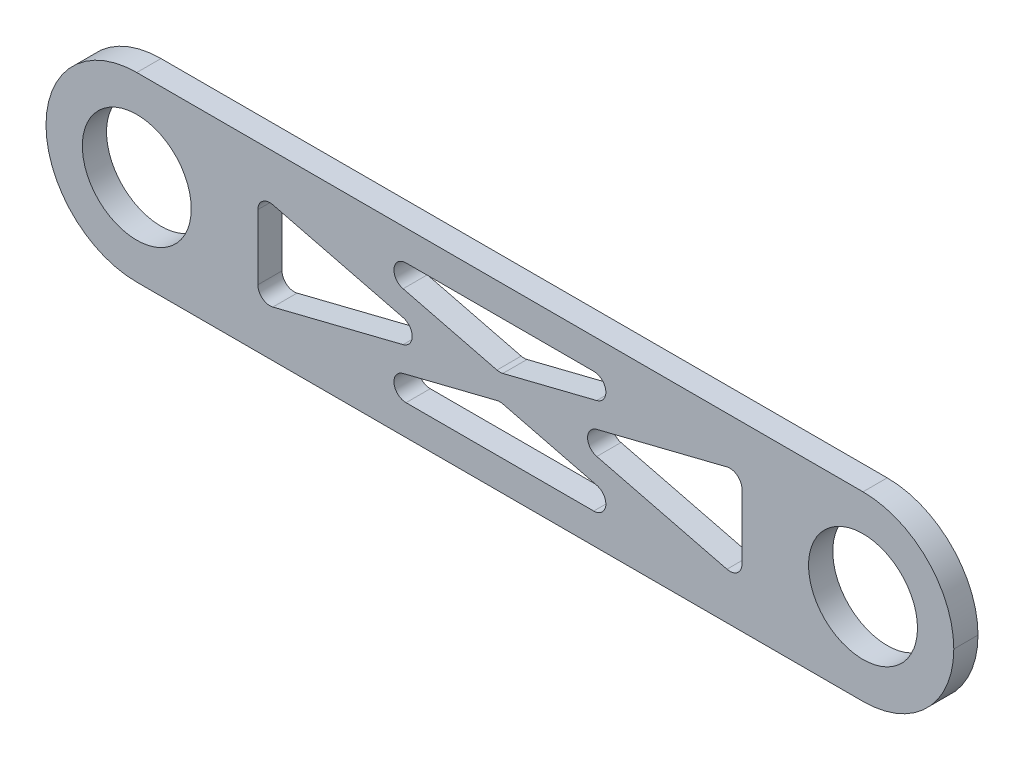
ISO-10303-21;
HEADER;
FILE_DESCRIPTION(('STEP AP214'),'2;1');
FILE_NAME('part.step','',(''),(''),'','','');
FILE_SCHEMA(('AUTOMOTIVE_DESIGN { 1 0 10303 214 1 1 1 1 }'));
ENDSEC;
DATA;
#1=APPLICATION_CONTEXT('core data for automotive mechanical design processes');
#2=APPLICATION_PROTOCOL_DEFINITION('international standard','automotive_design',2000,#1);
#3=PRODUCT_CONTEXT('',#1,'mechanical');
#4=PRODUCT('Part','Part','',(#3));
#5=PRODUCT_RELATED_PRODUCT_CATEGORY('part','',(#4));
#6=PRODUCT_DEFINITION_FORMATION('','',#4);
#7=PRODUCT_DEFINITION_CONTEXT('part definition',#1,'design');
#8=PRODUCT_DEFINITION('design','',#6,#7);
#9=PRODUCT_DEFINITION_SHAPE('','',#8);
#10=(LENGTH_UNIT() NAMED_UNIT(*) SI_UNIT(.MILLI.,.METRE.));
#11=(NAMED_UNIT(*) PLANE_ANGLE_UNIT() SI_UNIT($,.RADIAN.));
#12=(NAMED_UNIT(*) SI_UNIT($,.STERADIAN.) SOLID_ANGLE_UNIT());
#13=UNCERTAINTY_MEASURE_WITH_UNIT(LENGTH_MEASURE(1.E-05),#10,'distance_accuracy_value','');
#14=(GEOMETRIC_REPRESENTATION_CONTEXT(3) GLOBAL_UNCERTAINTY_ASSIGNED_CONTEXT((#13)) GLOBAL_UNIT_ASSIGNED_CONTEXT((#10,
#11,#12)) REPRESENTATION_CONTEXT('',''));
#15=CARTESIAN_POINT('',(0.,0.,0.));
#16=DIRECTION('',(0.,0.,1.));
#17=DIRECTION('',(1.,0.,0.));
#18=AXIS2_PLACEMENT_3D('',#15,#16,#17);
#19=CARTESIAN_POINT('',(0.,0.,2.));
#20=DIRECTION('',(0.,0.,-1.));
#21=DIRECTION('',(-1.,0.,0.));
#22=AXIS2_PLACEMENT_3D('',#19,#20,#21);
#23=PLANE('',#22);
#24=DIRECTION('',(0.970142500145332,0.242535625036333,0.));
#25=VECTOR('',#24,1.);
#26=CARTESIAN_POINT('',(-0.242535625036334,0.970142500145335,2.));
#27=LINE('',#26,#25);
#28=CARTESIAN_POINT('',(-18.7574643749637,-3.6585896873365,2.));
#29=VERTEX_POINT('',#28);
#30=CARTESIAN_POINT('',(-8.003675626199,-0.970142500145333,2.));
#31=VERTEX_POINT('',#30);
#32=EDGE_CURVE('E649',#29,#31,#27,.T.);
#33=ORIENTED_EDGE('',*,*,#32,.F.);
#34=CARTESIAN_POINT('',(-19.,-2.68844718719117,2.));
#35=DIRECTION('',(0.,0.,-1.));
#36=DIRECTION('',(-1.,0.,0.));
#37=AXIS2_PLACEMENT_3D('',#34,#35,#36);
#38=CIRCLE('',#37,1.);
#39=CARTESIAN_POINT('',(-20.,-2.68844718719117,2.));
#40=VERTEX_POINT('',#39);
#41=EDGE_CURVE('E466',#29,#40,#38,.T.);
#42=ORIENTED_EDGE('',*,*,#41,.T.);
#43=DIRECTION('',(0.,1.,0.));
#44=VECTOR('',#43,1.);
#45=CARTESIAN_POINT('',(-20.,0.,2.));
#46=LINE('',#45,#44);
#47=CARTESIAN_POINT('',(-20.,2.68844718719117,2.));
#48=VERTEX_POINT('',#47);
#49=EDGE_CURVE('E653',#40,#48,#46,.T.);
#50=ORIENTED_EDGE('',*,*,#49,.T.);
#51=CARTESIAN_POINT('',(-19.,2.68844718719117,2.));
#52=DIRECTION('',(0.,0.,-1.));
#53=DIRECTION('',(-1.,0.,0.));
#54=AXIS2_PLACEMENT_3D('',#51,#52,#53);
#55=CIRCLE('',#54,1.);
#56=CARTESIAN_POINT('',(-18.7574643749637,3.6585896873365,2.));
#57=VERTEX_POINT('',#56);
#58=EDGE_CURVE('E470',#48,#57,#55,.T.);
#59=ORIENTED_EDGE('',*,*,#58,.T.);
#60=DIRECTION('',(0.970142500145332,-0.242535625036333,0.));
#61=VECTOR('',#60,1.);
#62=CARTESIAN_POINT('',(-0.242535625036335,-0.970142500145337,2.));
#63=LINE('',#62,#61);
#64=CARTESIAN_POINT('',(-8.003675626199,0.970142500145332,2.));
#65=VERTEX_POINT('',#64);
#66=EDGE_CURVE('E650',#57,#65,#63,.T.);
#67=ORIENTED_EDGE('',*,*,#66,.T.);
#68=CARTESIAN_POINT('',(-8.24621125123533,0.,2.));
#69=DIRECTION('',(0.,0.,-1.));
#70=DIRECTION('',(-1.,0.,0.));
#71=AXIS2_PLACEMENT_3D('',#68,#69,#70);
#72=CIRCLE('',#71,1.);
#73=EDGE_CURVE('E462',#65,#31,#72,.T.);
#74=ORIENTED_EDGE('',*,*,#73,.T.);
#75=EDGE_LOOP('',(#33,#42,#50,#59,#67,#74));
#76=FACE_BOUND('',#75,.T.);
#77=DIRECTION('',(0.970142500145332,0.242535625036333,0.));
#78=VECTOR('',#77,1.);
#79=CARTESIAN_POINT('',(-0.242535625036334,0.970142500145335,2.));
#80=LINE('',#79,#78);
#81=CARTESIAN_POINT('',(0.242535625036327,1.0914103126635,2.));
#82=VERTEX_POINT('',#81);
#83=CARTESIAN_POINT('',(7.996324373801,3.02985749985467,2.));
#84=VERTEX_POINT('',#83);
#85=EDGE_CURVE('E529',#82,#84,#80,.T.);
#86=ORIENTED_EDGE('',*,*,#85,.F.);
#87=CARTESIAN_POINT('',(0.,2.06155281280883,2.));
#88=DIRECTION('',(0.,0.,-1.));
#89=DIRECTION('',(-1.,0.,0.));
#90=AXIS2_PLACEMENT_3D('',#87,#88,#89);
#91=CIRCLE('',#90,1.);
#92=CARTESIAN_POINT('',(-0.24253562503634,1.0914103126635,2.));
#93=VERTEX_POINT('',#92);
#94=EDGE_CURVE('E129',#82,#93,#91,.T.);
#95=ORIENTED_EDGE('',*,*,#94,.T.);
#96=DIRECTION('',(0.970142500145332,-0.242535625036333,0.));
#97=VECTOR('',#96,1.);
#98=CARTESIAN_POINT('',(0.242535625036333,0.970142500145332,2.));
#99=LINE('',#98,#97);
#100=CARTESIAN_POINT('',(-7.99632437380101,3.02985749985467,2.));
#101=VERTEX_POINT('',#100);
#102=EDGE_CURVE('E668',#101,#93,#99,.T.);
#103=ORIENTED_EDGE('',*,*,#102,.F.);
#104=CARTESIAN_POINT('',(-7.75378874876467,4.,2.));
#105=DIRECTION('',(0.,0.,-1.));
#106=DIRECTION('',(-1.,0.,0.));
#107=AXIS2_PLACEMENT_3D('',#104,#105,#106);
#108=CIRCLE('',#107,1.);
#109=CARTESIAN_POINT('',(-7.75378874876467,5.,2.));
#110=VERTEX_POINT('',#109);
#111=EDGE_CURVE('E482',#101,#110,#108,.T.);
#112=ORIENTED_EDGE('',*,*,#111,.T.);
#113=DIRECTION('',(1.,0.,0.));
#114=VECTOR('',#113,1.);
#115=CARTESIAN_POINT('',(0.,5.,2.));
#116=LINE('',#115,#114);
#117=CARTESIAN_POINT('',(7.75378874876466,5.,2.));
#118=VERTEX_POINT('',#117);
#119=EDGE_CURVE('E527',#110,#118,#116,.T.);
#120=ORIENTED_EDGE('',*,*,#119,.T.);
#121=CARTESIAN_POINT('',(7.75378874876466,4.,2.));
#122=DIRECTION('',(0.,0.,-1.));
#123=DIRECTION('',(-1.,0.,0.));
#124=AXIS2_PLACEMENT_3D('',#121,#122,#123);
#125=CIRCLE('',#124,1.);
#126=EDGE_CURVE('E121',#118,#84,#125,.T.);
#127=ORIENTED_EDGE('',*,*,#126,.T.);
#128=EDGE_LOOP('',(#86,#95,#103,#112,#120,#127));
#129=FACE_BOUND('',#128,.T.);
#130=CARTESIAN_POINT('',(-30.,0.,2.));
#131=DIRECTION('',(0.,0.,-1.));
#132=DIRECTION('',(-1.,0.,0.));
#133=AXIS2_PLACEMENT_3D('',#130,#131,#132);
#134=CIRCLE('',#133,7.5);
#135=CARTESIAN_POINT('',(-30.,7.5,2.));
#136=VERTEX_POINT('',#135);
#137=CARTESIAN_POINT('',(-37.5,0.,2.));
#138=VERTEX_POINT('',#137);
#139=EDGE_CURVE('E344',#136,#138,#134,.F.);
#140=ORIENTED_EDGE('',*,*,#139,.T.);
#141=CARTESIAN_POINT('',(-30.,0.,2.));
#142=DIRECTION('',(0.,0.,-1.));
#143=DIRECTION('',(-1.,0.,0.));
#144=AXIS2_PLACEMENT_3D('',#141,#142,#143);
#145=CIRCLE('',#144,7.5);
#146=CARTESIAN_POINT('',(-30.,-7.5,2.));
#147=VERTEX_POINT('',#146);
#148=EDGE_CURVE('E346',#138,#147,#145,.F.);
#149=ORIENTED_EDGE('',*,*,#148,.T.);
#150=DIRECTION('',(1.,0.,0.));
#151=VECTOR('',#150,1.);
#152=CARTESIAN_POINT('',(-37.5,-7.5,2.));
#153=LINE('',#152,#151);
#154=CARTESIAN_POINT('',(30.,-7.5,2.));
#155=VERTEX_POINT('',#154);
#156=EDGE_CURVE('E316',#147,#155,#153,.T.);
#157=ORIENTED_EDGE('',*,*,#156,.T.);
#158=CARTESIAN_POINT('',(30.,0.,2.));
#159=DIRECTION('',(0.,0.,-1.));
#160=DIRECTION('',(-1.,0.,0.));
#161=AXIS2_PLACEMENT_3D('',#158,#159,#160);
#162=CIRCLE('',#161,7.5);
#163=CARTESIAN_POINT('',(37.5,0.,2.));
#164=VERTEX_POINT('',#163);
#165=EDGE_CURVE('E342',#155,#164,#162,.F.);
#166=ORIENTED_EDGE('',*,*,#165,.T.);
#167=CARTESIAN_POINT('',(30.,0.,2.));
#168=DIRECTION('',(0.,0.,-1.));
#169=DIRECTION('',(-1.,0.,0.));
#170=AXIS2_PLACEMENT_3D('',#167,#168,#169);
#171=CIRCLE('',#170,7.5);
#172=CARTESIAN_POINT('',(30.,7.5,2.));
#173=VERTEX_POINT('',#172);
#174=EDGE_CURVE('E322',#164,#173,#171,.F.);
#175=ORIENTED_EDGE('',*,*,#174,.T.);
#176=DIRECTION('',(-1.,0.,0.));
#177=VECTOR('',#176,1.);
#178=CARTESIAN_POINT('',(-37.5,7.5,2.));
#179=LINE('',#178,#177);
#180=EDGE_CURVE('E545',#173,#136,#179,.T.);
#181=ORIENTED_EDGE('',*,*,#180,.T.);
#182=EDGE_LOOP('',(#140,#149,#157,#166,#175,#181));
#183=FACE_BOUND('',#182,.T.);
#184=CARTESIAN_POINT('',(30.,0.,2.));
#185=DIRECTION('',(0.,0.,1.));
#186=DIRECTION('',(1.,0.,0.));
#187=AXIS2_PLACEMENT_3D('',#184,#185,#186);
#188=CIRCLE('',#187,4.5);
#189=CARTESIAN_POINT('',(34.5,0.,2.));
#190=VERTEX_POINT('',#189);
#191=EDGE_CURVE('E538',#190,#190,#188,.T.);
#192=ORIENTED_EDGE('',*,*,#191,.F.);
#193=EDGE_LOOP('',(#192));
#194=FACE_BOUND('',#193,.T.);
#195=CARTESIAN_POINT('',(-30.,0.,2.));
#196=DIRECTION('',(0.,0.,1.));
#197=DIRECTION('',(1.,0.,0.));
#198=AXIS2_PLACEMENT_3D('',#195,#196,#197);
#199=CIRCLE('',#198,4.5);
#200=CARTESIAN_POINT('',(-25.5,0.,2.));
#201=VERTEX_POINT('',#200);
#202=EDGE_CURVE('E534',#201,#201,#199,.T.);
#203=ORIENTED_EDGE('',*,*,#202,.F.);
#204=EDGE_LOOP('',(#203));
#205=FACE_BOUND('',#204,.T.);
#206=DIRECTION('',(0.970142500145332,-0.242535625036333,0.));
#207=VECTOR('',#206,1.);
#208=CARTESIAN_POINT('',(0.242535625036333,0.970142500145333,2.));
#209=LINE('',#208,#207);
#210=CARTESIAN_POINT('',(8.00367562619899,-0.970142500145332,2.));
#211=VERTEX_POINT('',#210);
#212=CARTESIAN_POINT('',(18.7574643749637,-3.6585896873365,2.));
#213=VERTEX_POINT('',#212);
#214=EDGE_CURVE('E496',#211,#213,#209,.T.);
#215=ORIENTED_EDGE('',*,*,#214,.F.);
#216=CARTESIAN_POINT('',(8.24621125123532,0.,2.));
#217=DIRECTION('',(0.,0.,-1.));
#218=DIRECTION('',(-1.,0.,0.));
#219=AXIS2_PLACEMENT_3D('',#216,#217,#218);
#220=CIRCLE('',#219,1.);
#221=CARTESIAN_POINT('',(8.00367562619899,0.970142500145332,2.));
#222=VERTEX_POINT('',#221);
#223=EDGE_CURVE('E474',#211,#222,#220,.T.);
#224=ORIENTED_EDGE('',*,*,#223,.T.);
#225=DIRECTION('',(0.970142500145332,0.242535625036333,0.));
#226=VECTOR('',#225,1.);
#227=CARTESIAN_POINT('',(0.242535625036333,-0.970142500145333,2.));
#228=LINE('',#227,#226);
#229=CARTESIAN_POINT('',(18.7574643749637,3.6585896873365,2.));
#230=VERTEX_POINT('',#229);
#231=EDGE_CURVE('E506',#222,#230,#228,.T.);
#232=ORIENTED_EDGE('',*,*,#231,.T.);
#233=CARTESIAN_POINT('',(19.,2.68844718719117,2.));
#234=DIRECTION('',(0.,0.,-1.));
#235=DIRECTION('',(-1.,0.,0.));
#236=AXIS2_PLACEMENT_3D('',#233,#234,#235);
#237=CIRCLE('',#236,1.);
#238=CARTESIAN_POINT('',(20.,2.68844718719117,2.));
#239=VERTEX_POINT('',#238);
#240=EDGE_CURVE('E478',#230,#239,#237,.T.);
#241=ORIENTED_EDGE('',*,*,#240,.T.);
#242=DIRECTION('',(0.,1.,0.));
#243=VECTOR('',#242,1.);
#244=CARTESIAN_POINT('',(20.,0.,2.));
#245=LINE('',#244,#243);
#246=CARTESIAN_POINT('',(20.,-2.68844718719117,2.));
#247=VERTEX_POINT('',#246);
#248=EDGE_CURVE('E498',#247,#239,#245,.T.);
#249=ORIENTED_EDGE('',*,*,#248,.F.);
#250=CARTESIAN_POINT('',(19.,-2.68844718719117,2.));
#251=DIRECTION('',(0.,0.,-1.));
#252=DIRECTION('',(-1.,0.,0.));
#253=AXIS2_PLACEMENT_3D('',#250,#251,#252);
#254=CIRCLE('',#253,1.);
#255=EDGE_CURVE('E114',#247,#213,#254,.T.);
#256=ORIENTED_EDGE('',*,*,#255,.T.);
#257=EDGE_LOOP('',(#215,#224,#232,#241,#249,#256));
#258=FACE_BOUND('',#257,.T.);
#259=DIRECTION('',(0.970142500145332,0.242535625036333,0.));
#260=VECTOR('',#259,1.);
#261=CARTESIAN_POINT('',(0.242535625036333,-0.970142500145332,2.));
#262=LINE('',#261,#260);
#263=CARTESIAN_POINT('',(-7.99632437380101,-3.02985749985467,2.));
#264=VERTEX_POINT('',#263);
#265=CARTESIAN_POINT('',(-0.242535625036342,-1.0914103126635,2.));
#266=VERTEX_POINT('',#265);
#267=EDGE_CURVE('E662',#264,#266,#262,.T.);
#268=ORIENTED_EDGE('',*,*,#267,.T.);
#269=CARTESIAN_POINT('',(0.,-2.06155281280883,2.));
#270=DIRECTION('',(0.,0.,-1.));
#271=DIRECTION('',(-1.,0.,0.));
#272=AXIS2_PLACEMENT_3D('',#269,#270,#271);
#273=CIRCLE('',#272,1.);
#274=CARTESIAN_POINT('',(0.242535625036324,-1.0914103126635,2.));
#275=VERTEX_POINT('',#274);
#276=EDGE_CURVE('E454',#266,#275,#273,.T.);
#277=ORIENTED_EDGE('',*,*,#276,.T.);
#278=DIRECTION('',(0.970142500145332,-0.242535625036333,0.));
#279=VECTOR('',#278,1.);
#280=CARTESIAN_POINT('',(-0.242535625036334,-0.970142500145336,2.));
#281=LINE('',#280,#279);
#282=CARTESIAN_POINT('',(7.99632437380098,-3.02985749985467,2.));
#283=VERTEX_POINT('',#282);
#284=EDGE_CURVE('E655',#275,#283,#281,.T.);
#285=ORIENTED_EDGE('',*,*,#284,.T.);
#286=CARTESIAN_POINT('',(7.75378874876465,-4.,2.));
#287=DIRECTION('',(0.,0.,-1.));
#288=DIRECTION('',(-1.,0.,0.));
#289=AXIS2_PLACEMENT_3D('',#286,#287,#288);
#290=CIRCLE('',#289,1.);
#291=CARTESIAN_POINT('',(7.75378874876465,-5.,2.));
#292=VERTEX_POINT('',#291);
#293=EDGE_CURVE('E458',#283,#292,#290,.T.);
#294=ORIENTED_EDGE('',*,*,#293,.T.);
#295=DIRECTION('',(1.,0.,0.));
#296=VECTOR('',#295,1.);
#297=CARTESIAN_POINT('',(0.,-5.,2.));
#298=LINE('',#297,#296);
#299=CARTESIAN_POINT('',(-7.75378874876467,-5.,2.));
#300=VERTEX_POINT('',#299);
#301=EDGE_CURVE('E665',#300,#292,#298,.T.);
#302=ORIENTED_EDGE('',*,*,#301,.F.);
#303=CARTESIAN_POINT('',(-7.75378874876467,-4.,2.));
#304=DIRECTION('',(0.,0.,-1.));
#305=DIRECTION('',(-1.,0.,0.));
#306=AXIS2_PLACEMENT_3D('',#303,#304,#305);
#307=CIRCLE('',#306,1.);
#308=EDGE_CURVE('E450',#300,#264,#307,.T.);
#309=ORIENTED_EDGE('',*,*,#308,.T.);
#310=EDGE_LOOP('',(#268,#277,#285,#294,#302,#309));
#311=FACE_BOUND('',#310,.T.);
#312=ADVANCED_FACE('F106',(#76,#129,#183,#194,#205,#258,#311),#23,.F.);
#313=CARTESIAN_POINT('',(0.,0.,0.));
#314=DIRECTION('',(0.,0.,-1.));
#315=DIRECTION('',(-1.,0.,0.));
#316=AXIS2_PLACEMENT_3D('',#313,#314,#315);
#317=PLANE('',#316);
#318=DIRECTION('',(-0.970142500145332,0.242535625036333,0.));
#319=VECTOR('',#318,1.);
#320=CARTESIAN_POINT('',(0.242535625036333,0.970142500145332,0.));
#321=LINE('',#320,#319);
#322=CARTESIAN_POINT('',(-0.24253562503634,1.0914103126635,0.));
#323=VERTEX_POINT('',#322);
#324=CARTESIAN_POINT('',(-7.99632437380101,3.02985749985467,0.));
#325=VERTEX_POINT('',#324);
#326=EDGE_CURVE('E370',#323,#325,#321,.T.);
#327=ORIENTED_EDGE('',*,*,#326,.F.);
#328=CARTESIAN_POINT('',(0.,2.06155281280883,0.));
#329=DIRECTION('',(0.,0.,-1.));
#330=DIRECTION('',(-1.,0.,0.));
#331=AXIS2_PLACEMENT_3D('',#328,#329,#330);
#332=CIRCLE('',#331,1.);
#333=CARTESIAN_POINT('',(0.242535625036327,1.0914103126635,0.));
#334=VERTEX_POINT('',#333);
#335=EDGE_CURVE('E490',#323,#334,#332,.F.);
#336=ORIENTED_EDGE('',*,*,#335,.T.);
#337=DIRECTION('',(-0.970142500145332,-0.242535625036333,0.));
#338=VECTOR('',#337,1.);
#339=CARTESIAN_POINT('',(-0.242535625036334,0.970142500145335,0.));
#340=LINE('',#339,#338);
#341=CARTESIAN_POINT('',(7.996324373801,3.02985749985467,0.));
#342=VERTEX_POINT('',#341);
#343=EDGE_CURVE('E364',#342,#334,#340,.T.);
#344=ORIENTED_EDGE('',*,*,#343,.F.);
#345=CARTESIAN_POINT('',(7.75378874876466,4.,0.));
#346=DIRECTION('',(0.,0.,-1.));
#347=DIRECTION('',(-1.,0.,0.));
#348=AXIS2_PLACEMENT_3D('',#345,#346,#347);
#349=CIRCLE('',#348,1.);
#350=CARTESIAN_POINT('',(7.75378874876466,5.,0.));
#351=VERTEX_POINT('',#350);
#352=EDGE_CURVE('E487',#342,#351,#349,.F.);
#353=ORIENTED_EDGE('',*,*,#352,.T.);
#354=DIRECTION('',(-1.,0.,0.));
#355=VECTOR('',#354,1.);
#356=CARTESIAN_POINT('',(0.,5.,0.));
#357=LINE('',#356,#355);
#358=CARTESIAN_POINT('',(-7.75378874876467,5.,0.));
#359=VERTEX_POINT('',#358);
#360=EDGE_CURVE('E367',#351,#359,#357,.T.);
#361=ORIENTED_EDGE('',*,*,#360,.T.);
#362=CARTESIAN_POINT('',(-7.75378874876467,4.,0.));
#363=DIRECTION('',(0.,0.,-1.));
#364=DIRECTION('',(-1.,0.,0.));
#365=AXIS2_PLACEMENT_3D('',#362,#363,#364);
#366=CIRCLE('',#365,1.);
#367=EDGE_CURVE('E484',#359,#325,#366,.F.);
#368=ORIENTED_EDGE('',*,*,#367,.T.);
#369=EDGE_LOOP('',(#327,#336,#344,#353,#361,#368));
#370=FACE_BOUND('',#369,.T.);
#371=CARTESIAN_POINT('',(-30.,0.,0.));
#372=DIRECTION('',(0.,0.,1.));
#373=DIRECTION('',(1.,0.,0.));
#374=AXIS2_PLACEMENT_3D('',#371,#372,#373);
#375=CIRCLE('',#374,4.5);
#376=CARTESIAN_POINT('',(-25.5,0.,0.));
#377=VERTEX_POINT('',#376);
#378=EDGE_CURVE('E535',#377,#377,#375,.T.);
#379=ORIENTED_EDGE('',*,*,#378,.T.);
#380=EDGE_LOOP('',(#379));
#381=FACE_BOUND('',#380,.T.);
#382=CARTESIAN_POINT('',(30.,0.,0.));
#383=DIRECTION('',(0.,0.,1.));
#384=DIRECTION('',(1.,0.,0.));
#385=AXIS2_PLACEMENT_3D('',#382,#383,#384);
#386=CIRCLE('',#385,4.5);
#387=CARTESIAN_POINT('',(34.5,0.,0.));
#388=VERTEX_POINT('',#387);
#389=EDGE_CURVE('E355',#388,#388,#386,.T.);
#390=ORIENTED_EDGE('',*,*,#389,.T.);
#391=EDGE_LOOP('',(#390));
#392=FACE_BOUND('',#391,.T.);
#393=DIRECTION('',(1.,0.,0.));
#394=VECTOR('',#393,1.);
#395=CARTESIAN_POINT('',(-37.5,-7.5,0.));
#396=LINE('',#395,#394);
#397=CARTESIAN_POINT('',(-30.,-7.5,0.));
#398=VERTEX_POINT('',#397);
#399=CARTESIAN_POINT('',(30.,-7.5,0.));
#400=VERTEX_POINT('',#399);
#401=EDGE_CURVE('E548',#398,#400,#396,.T.);
#402=ORIENTED_EDGE('',*,*,#401,.F.);
#403=CARTESIAN_POINT('',(-30.,0.,0.));
#404=DIRECTION('',(0.,0.,-1.));
#405=DIRECTION('',(-1.,0.,0.));
#406=AXIS2_PLACEMENT_3D('',#403,#404,#405);
#407=CIRCLE('',#406,7.5);
#408=CARTESIAN_POINT('',(-37.5,0.,0.));
#409=VERTEX_POINT('',#408);
#410=EDGE_CURVE('E332',#398,#409,#407,.T.);
#411=ORIENTED_EDGE('',*,*,#410,.T.);
#412=CARTESIAN_POINT('',(-30.,0.,0.));
#413=DIRECTION('',(0.,0.,-1.));
#414=DIRECTION('',(-1.,0.,0.));
#415=AXIS2_PLACEMENT_3D('',#412,#413,#414);
#416=CIRCLE('',#415,7.5);
#417=CARTESIAN_POINT('',(-30.,7.5,0.));
#418=VERTEX_POINT('',#417);
#419=EDGE_CURVE('E330',#409,#418,#416,.T.);
#420=ORIENTED_EDGE('',*,*,#419,.T.);
#421=DIRECTION('',(-1.,0.,0.));
#422=VECTOR('',#421,1.);
#423=CARTESIAN_POINT('',(-37.5,7.5,0.));
#424=LINE('',#423,#422);
#425=CARTESIAN_POINT('',(30.,7.5,0.));
#426=VERTEX_POINT('',#425);
#427=EDGE_CURVE('E313',#426,#418,#424,.T.);
#428=ORIENTED_EDGE('',*,*,#427,.F.);
#429=CARTESIAN_POINT('',(30.,0.,0.));
#430=DIRECTION('',(0.,0.,-1.));
#431=DIRECTION('',(-1.,0.,0.));
#432=AXIS2_PLACEMENT_3D('',#429,#430,#431);
#433=CIRCLE('',#432,7.5);
#434=CARTESIAN_POINT('',(37.5,0.,0.));
#435=VERTEX_POINT('',#434);
#436=EDGE_CURVE('E304',#426,#435,#433,.T.);
#437=ORIENTED_EDGE('',*,*,#436,.T.);
#438=CARTESIAN_POINT('',(30.,0.,0.));
#439=DIRECTION('',(0.,0.,-1.));
#440=DIRECTION('',(-1.,0.,0.));
#441=AXIS2_PLACEMENT_3D('',#438,#439,#440);
#442=CIRCLE('',#441,7.5);
#443=EDGE_CURVE('E310',#435,#400,#442,.T.);
#444=ORIENTED_EDGE('',*,*,#443,.T.);
#445=EDGE_LOOP('',(#402,#411,#420,#428,#437,#444));
#446=FACE_BOUND('',#445,.T.);
#447=DIRECTION('',(0.,-1.,0.));
#448=VECTOR('',#447,1.);
#449=CARTESIAN_POINT('',(20.,0.,0.));
#450=LINE('',#449,#448);
#451=CARTESIAN_POINT('',(20.,2.68844718719117,0.));
#452=VERTEX_POINT('',#451);
#453=CARTESIAN_POINT('',(20.,-2.68844718719117,0.));
#454=VERTEX_POINT('',#453);
#455=EDGE_CURVE('E358',#452,#454,#450,.T.);
#456=ORIENTED_EDGE('',*,*,#455,.F.);
#457=CARTESIAN_POINT('',(19.,2.68844718719117,0.));
#458=DIRECTION('',(0.,0.,-1.));
#459=DIRECTION('',(-1.,0.,0.));
#460=AXIS2_PLACEMENT_3D('',#457,#458,#459);
#461=CIRCLE('',#460,1.);
#462=CARTESIAN_POINT('',(18.7574643749637,3.6585896873365,0.));
#463=VERTEX_POINT('',#462);
#464=EDGE_CURVE('E480',#452,#463,#461,.F.);
#465=ORIENTED_EDGE('',*,*,#464,.T.);
#466=DIRECTION('',(-0.970142500145332,-0.242535625036333,0.));
#467=VECTOR('',#466,1.);
#468=CARTESIAN_POINT('',(0.242535625036333,-0.970142500145333,0.));
#469=LINE('',#468,#467);
#470=CARTESIAN_POINT('',(8.00367562619899,0.970142500145332,0.));
#471=VERTEX_POINT('',#470);
#472=EDGE_CURVE('E361',#463,#471,#469,.T.);
#473=ORIENTED_EDGE('',*,*,#472,.T.);
#474=CARTESIAN_POINT('',(8.24621125123532,0.,0.));
#475=DIRECTION('',(0.,0.,-1.));
#476=DIRECTION('',(-1.,0.,0.));
#477=AXIS2_PLACEMENT_3D('',#474,#475,#476);
#478=CIRCLE('',#477,1.);
#479=CARTESIAN_POINT('',(8.00367562619899,-0.970142500145332,0.));
#480=VERTEX_POINT('',#479);
#481=EDGE_CURVE('E476',#471,#480,#478,.F.);
#482=ORIENTED_EDGE('',*,*,#481,.T.);
#483=DIRECTION('',(-0.970142500145332,0.242535625036333,0.));
#484=VECTOR('',#483,1.);
#485=CARTESIAN_POINT('',(0.242535625036333,0.970142500145333,0.));
#486=LINE('',#485,#484);
#487=CARTESIAN_POINT('',(18.7574643749637,-3.6585896873365,0.));
#488=VERTEX_POINT('',#487);
#489=EDGE_CURVE('E351',#488,#480,#486,.T.);
#490=ORIENTED_EDGE('',*,*,#489,.F.);
#491=CARTESIAN_POINT('',(19.,-2.68844718719117,0.));
#492=DIRECTION('',(0.,0.,-1.));
#493=DIRECTION('',(-1.,0.,0.));
#494=AXIS2_PLACEMENT_3D('',#491,#492,#493);
#495=CIRCLE('',#494,1.);
#496=EDGE_CURVE('E12',#488,#454,#495,.F.);
#497=ORIENTED_EDGE('',*,*,#496,.T.);
#498=EDGE_LOOP('',(#456,#465,#473,#482,#490,#497));
#499=FACE_BOUND('',#498,.T.);
#500=DIRECTION('',(-0.970142500145332,-0.242535625036333,0.));
#501=VECTOR('',#500,1.);
#502=CARTESIAN_POINT('',(-0.242535625036334,0.970142500145335,0.));
#503=LINE('',#502,#501);
#504=CARTESIAN_POINT('',(-8.003675626199,-0.970142500145333,0.));
#505=VERTEX_POINT('',#504);
#506=CARTESIAN_POINT('',(-18.7574643749637,-3.6585896873365,0.));
#507=VERTEX_POINT('',#506);
#508=EDGE_CURVE('E373',#505,#507,#503,.T.);
#509=ORIENTED_EDGE('',*,*,#508,.F.);
#510=CARTESIAN_POINT('',(-8.24621125123533,0.,0.));
#511=DIRECTION('',(0.,0.,-1.));
#512=DIRECTION('',(-1.,0.,0.));
#513=AXIS2_PLACEMENT_3D('',#510,#511,#512);
#514=CIRCLE('',#513,1.);
#515=CARTESIAN_POINT('',(-8.003675626199,0.970142500145332,0.));
#516=VERTEX_POINT('',#515);
#517=EDGE_CURVE('E464',#505,#516,#514,.F.);
#518=ORIENTED_EDGE('',*,*,#517,.T.);
#519=DIRECTION('',(-0.970142500145332,0.242535625036333,0.));
#520=VECTOR('',#519,1.);
#521=CARTESIAN_POINT('',(-0.242535625036335,-0.970142500145337,0.));
#522=LINE('',#521,#520);
#523=CARTESIAN_POINT('',(-18.7574643749637,3.6585896873365,0.));
#524=VERTEX_POINT('',#523);
#525=EDGE_CURVE('E376',#516,#524,#522,.T.);
#526=ORIENTED_EDGE('',*,*,#525,.T.);
#527=CARTESIAN_POINT('',(-19.,2.68844718719117,0.));
#528=DIRECTION('',(0.,0.,-1.));
#529=DIRECTION('',(-1.,0.,0.));
#530=AXIS2_PLACEMENT_3D('',#527,#528,#529);
#531=CIRCLE('',#530,1.);
#532=CARTESIAN_POINT('',(-20.,2.68844718719117,0.));
#533=VERTEX_POINT('',#532);
#534=EDGE_CURVE('E472',#524,#533,#531,.F.);
#535=ORIENTED_EDGE('',*,*,#534,.T.);
#536=DIRECTION('',(0.,-1.,0.));
#537=VECTOR('',#536,1.);
#538=CARTESIAN_POINT('',(-20.,0.,0.));
#539=LINE('',#538,#537);
#540=CARTESIAN_POINT('',(-20.,-2.68844718719117,0.));
#541=VERTEX_POINT('',#540);
#542=EDGE_CURVE('E379',#533,#541,#539,.T.);
#543=ORIENTED_EDGE('',*,*,#542,.T.);
#544=CARTESIAN_POINT('',(-19.,-2.68844718719117,0.));
#545=DIRECTION('',(0.,0.,-1.));
#546=DIRECTION('',(-1.,0.,0.));
#547=AXIS2_PLACEMENT_3D('',#544,#545,#546);
#548=CIRCLE('',#547,1.);
#549=EDGE_CURVE('E468',#541,#507,#548,.F.);
#550=ORIENTED_EDGE('',*,*,#549,.T.);
#551=EDGE_LOOP('',(#509,#518,#526,#535,#543,#550));
#552=FACE_BOUND('',#551,.T.);
#553=DIRECTION('',(-1.,0.,0.));
#554=VECTOR('',#553,1.);
#555=CARTESIAN_POINT('',(0.,-5.,0.));
#556=LINE('',#555,#554);
#557=CARTESIAN_POINT('',(7.75378874876465,-5.,0.));
#558=VERTEX_POINT('',#557);
#559=CARTESIAN_POINT('',(-7.75378874876467,-5.,0.));
#560=VERTEX_POINT('',#559);
#561=EDGE_CURVE('E385',#558,#560,#556,.T.);
#562=ORIENTED_EDGE('',*,*,#561,.F.);
#563=CARTESIAN_POINT('',(7.75378874876465,-4.,0.));
#564=DIRECTION('',(0.,0.,-1.));
#565=DIRECTION('',(-1.,0.,0.));
#566=AXIS2_PLACEMENT_3D('',#563,#564,#565);
#567=CIRCLE('',#566,1.);
#568=CARTESIAN_POINT('',(7.99632437380098,-3.02985749985467,0.));
#569=VERTEX_POINT('',#568);
#570=EDGE_CURVE('E460',#558,#569,#567,.F.);
#571=ORIENTED_EDGE('',*,*,#570,.T.);
#572=DIRECTION('',(-0.970142500145332,0.242535625036333,0.));
#573=VECTOR('',#572,1.);
#574=CARTESIAN_POINT('',(-0.242535625036334,-0.970142500145336,0.));
#575=LINE('',#574,#573);
#576=CARTESIAN_POINT('',(0.242535625036325,-1.0914103126635,0.));
#577=VERTEX_POINT('',#576);
#578=EDGE_CURVE('E388',#569,#577,#575,.T.);
#579=ORIENTED_EDGE('',*,*,#578,.T.);
#580=CARTESIAN_POINT('',(0.,-2.06155281280883,0.));
#581=DIRECTION('',(0.,0.,-1.));
#582=DIRECTION('',(-1.,0.,0.));
#583=AXIS2_PLACEMENT_3D('',#580,#581,#582);
#584=CIRCLE('',#583,1.);
#585=CARTESIAN_POINT('',(-0.242535625036342,-1.0914103126635,0.));
#586=VERTEX_POINT('',#585);
#587=EDGE_CURVE('E456',#577,#586,#584,.F.);
#588=ORIENTED_EDGE('',*,*,#587,.T.);
#589=DIRECTION('',(-0.970142500145332,-0.242535625036333,0.));
#590=VECTOR('',#589,1.);
#591=CARTESIAN_POINT('',(0.242535625036333,-0.970142500145332,0.));
#592=LINE('',#591,#590);
#593=CARTESIAN_POINT('',(-7.99632437380101,-3.02985749985467,0.));
#594=VERTEX_POINT('',#593);
#595=EDGE_CURVE('E382',#586,#594,#592,.T.);
#596=ORIENTED_EDGE('',*,*,#595,.T.);
#597=CARTESIAN_POINT('',(-7.75378874876467,-4.,0.));
#598=DIRECTION('',(0.,0.,-1.));
#599=DIRECTION('',(-1.,0.,0.));
#600=AXIS2_PLACEMENT_3D('',#597,#598,#599);
#601=CIRCLE('',#600,1.);
#602=EDGE_CURVE('E452',#594,#560,#601,.F.);
#603=ORIENTED_EDGE('',*,*,#602,.T.);
#604=EDGE_LOOP('',(#562,#571,#579,#588,#596,#603));
#605=FACE_BOUND('',#604,.T.);
#606=ADVANCED_FACE('F307',(#370,#381,#392,#446,#499,#552,#605),#317,.T.);
#607=CARTESIAN_POINT('',(-37.5,7.5,2.));
#608=DIRECTION('',(0.,-1.,0.));
#609=DIRECTION('',(0.,0.,-1.));
#610=AXIS2_PLACEMENT_3D('',#607,#608,#609);
#611=PLANE('',#610);
#612=ORIENTED_EDGE('',*,*,#427,.T.);
#613=DIRECTION('',(0.,0.,-1.));
#614=VECTOR('',#613,1.);
#615=CARTESIAN_POINT('',(-30.,7.5,2.));
#616=LINE('',#615,#614);
#617=EDGE_CURVE('E350',#418,#136,#616,.F.);
#618=ORIENTED_EDGE('',*,*,#617,.T.);
#619=ORIENTED_EDGE('',*,*,#180,.F.);
#620=DIRECTION('',(0.,0.,-1.));
#621=VECTOR('',#620,1.);
#622=CARTESIAN_POINT('',(30.,7.5,2.));
#623=LINE('',#622,#621);
#624=EDGE_CURVE('E348',#173,#426,#623,.T.);
#625=ORIENTED_EDGE('',*,*,#624,.T.);
#626=EDGE_LOOP('',(#612,#618,#619,#625));
#627=FACE_BOUND('',#626,.T.);
#628=ADVANCED_FACE('F568',(#627),#611,.F.);
#629=CARTESIAN_POINT('',(-37.5,-7.5,2.));
#630=DIRECTION('',(0.,1.,0.));
#631=DIRECTION('',(0.,0.,1.));
#632=AXIS2_PLACEMENT_3D('',#629,#630,#631);
#633=PLANE('',#632);
#634=ORIENTED_EDGE('',*,*,#401,.T.);
#635=DIRECTION('',(0.,0.,-1.));
#636=VECTOR('',#635,1.);
#637=CARTESIAN_POINT('',(30.,-7.5,2.));
#638=LINE('',#637,#636);
#639=EDGE_CURVE('E329',#400,#155,#638,.F.);
#640=ORIENTED_EDGE('',*,*,#639,.T.);
#641=ORIENTED_EDGE('',*,*,#156,.F.);
#642=DIRECTION('',(0.,0.,-1.));
#643=VECTOR('',#642,1.);
#644=CARTESIAN_POINT('',(-30.,-7.5,2.));
#645=LINE('',#644,#643);
#646=EDGE_CURVE('E337',#147,#398,#645,.T.);
#647=ORIENTED_EDGE('',*,*,#646,.T.);
#648=EDGE_LOOP('',(#634,#640,#641,#647));
#649=FACE_BOUND('',#648,.T.);
#650=ADVANCED_FACE('F552',(#649),#633,.F.);
#651=CARTESIAN_POINT('',(30.,0.,2.));
#652=DIRECTION('',(0.,0.,-1.));
#653=DIRECTION('',(-1.,0.,0.));
#654=AXIS2_PLACEMENT_3D('',#651,#652,#653);
#655=CYLINDRICAL_SURFACE('',#654,7.5);
#656=ORIENTED_EDGE('',*,*,#624,.F.);
#657=ORIENTED_EDGE('',*,*,#174,.F.);
#658=DIRECTION('',(0.,0.,-1.));
#659=VECTOR('',#658,1.);
#660=CARTESIAN_POINT('',(37.5,0.,2.));
#661=LINE('',#660,#659);
#662=EDGE_CURVE('E320',#435,#164,#661,.F.);
#663=ORIENTED_EDGE('',*,*,#662,.F.);
#664=ORIENTED_EDGE('',*,*,#436,.F.);
#665=EDGE_LOOP('',(#656,#657,#663,#664));
#666=FACE_BOUND('',#665,.T.);
#667=ADVANCED_FACE('F321',(#666),#655,.T.);
#668=CARTESIAN_POINT('',(30.,0.,2.));
#669=DIRECTION('',(0.,0.,-1.));
#670=DIRECTION('',(-1.,0.,0.));
#671=AXIS2_PLACEMENT_3D('',#668,#669,#670);
#672=CYLINDRICAL_SURFACE('',#671,7.5);
#673=ORIENTED_EDGE('',*,*,#165,.F.);
#674=ORIENTED_EDGE('',*,*,#639,.F.);
#675=ORIENTED_EDGE('',*,*,#443,.F.);
#676=ORIENTED_EDGE('',*,*,#662,.T.);
#677=EDGE_LOOP('',(#673,#674,#675,#676));
#678=FACE_BOUND('',#677,.T.);
#679=ADVANCED_FACE('F327',(#678),#672,.T.);
#680=CARTESIAN_POINT('',(-30.,0.,2.));
#681=DIRECTION('',(0.,0.,-1.));
#682=DIRECTION('',(-1.,0.,0.));
#683=AXIS2_PLACEMENT_3D('',#680,#681,#682);
#684=CYLINDRICAL_SURFACE('',#683,7.5);
#685=DIRECTION('',(0.,0.,-1.));
#686=VECTOR('',#685,1.);
#687=CARTESIAN_POINT('',(-37.5,0.,2.));
#688=LINE('',#687,#686);
#689=EDGE_CURVE('E324',#138,#409,#688,.T.);
#690=ORIENTED_EDGE('',*,*,#689,.F.);
#691=ORIENTED_EDGE('',*,*,#139,.F.);
#692=ORIENTED_EDGE('',*,*,#617,.F.);
#693=ORIENTED_EDGE('',*,*,#419,.F.);
#694=EDGE_LOOP('',(#690,#691,#692,#693));
#695=FACE_BOUND('',#694,.T.);
#696=ADVANCED_FACE('F560',(#695),#684,.T.);
#697=CARTESIAN_POINT('',(-30.,0.,2.));
#698=DIRECTION('',(0.,0.,-1.));
#699=DIRECTION('',(-1.,0.,0.));
#700=AXIS2_PLACEMENT_3D('',#697,#698,#699);
#701=CYLINDRICAL_SURFACE('',#700,7.5);
#702=ORIENTED_EDGE('',*,*,#148,.F.);
#703=ORIENTED_EDGE('',*,*,#689,.T.);
#704=ORIENTED_EDGE('',*,*,#410,.F.);
#705=ORIENTED_EDGE('',*,*,#646,.F.);
#706=EDGE_LOOP('',(#702,#703,#704,#705));
#707=FACE_BOUND('',#706,.T.);
#708=ADVANCED_FACE('F563',(#707),#701,.T.);
#709=CARTESIAN_POINT('',(30.,0.,0.));
#710=DIRECTION('',(0.,0.,1.));
#711=DIRECTION('',(1.,0.,0.));
#712=AXIS2_PLACEMENT_3D('',#709,#710,#711);
#713=CYLINDRICAL_SURFACE('',#712,4.5);
#714=ORIENTED_EDGE('',*,*,#389,.F.);
#715=EDGE_LOOP('',(#714));
#716=FACE_BOUND('',#715,.T.);
#717=ORIENTED_EDGE('',*,*,#191,.T.);
#718=EDGE_LOOP('',(#717));
#719=FACE_BOUND('',#718,.T.);
#720=ADVANCED_FACE('F586',(#716,#719),#713,.F.);
#721=CARTESIAN_POINT('',(-30.,0.,0.));
#722=DIRECTION('',(0.,0.,1.));
#723=DIRECTION('',(1.,0.,0.));
#724=AXIS2_PLACEMENT_3D('',#721,#722,#723);
#725=CYLINDRICAL_SURFACE('',#724,4.5);
#726=ORIENTED_EDGE('',*,*,#378,.F.);
#727=EDGE_LOOP('',(#726));
#728=FACE_BOUND('',#727,.T.);
#729=ORIENTED_EDGE('',*,*,#202,.T.);
#730=EDGE_LOOP('',(#729));
#731=FACE_BOUND('',#730,.T.);
#732=ADVANCED_FACE('F589',(#728,#731),#725,.F.);
#733=CARTESIAN_POINT('',(0.242535625036333,-0.970142500145333,-8.));
#734=DIRECTION('',(0.242535625036333,-0.970142500145332,0.));
#735=DIRECTION('',(0.970142500145332,0.242535625036333,0.));
#736=AXIS2_PLACEMENT_3D('',#733,#734,#735);
#737=PLANE('',#736);
#738=ORIENTED_EDGE('',*,*,#231,.F.);
#739=DIRECTION('',(0.,0.,1.));
#740=VECTOR('',#739,1.);
#741=CARTESIAN_POINT('',(8.00367562619899,0.970142500145331,-8.));
#742=LINE('',#741,#740);
#743=EDGE_CURVE('E429',#222,#471,#742,.F.);
#744=ORIENTED_EDGE('',*,*,#743,.T.);
#745=ORIENTED_EDGE('',*,*,#472,.F.);
#746=DIRECTION('',(0.,0.,1.));
#747=VECTOR('',#746,1.);
#748=CARTESIAN_POINT('',(18.7574643749637,3.6585896873365,-8.));
#749=LINE('',#748,#747);
#750=EDGE_CURVE('E426',#463,#230,#749,.T.);
#751=ORIENTED_EDGE('',*,*,#750,.T.);
#752=EDGE_LOOP('',(#738,#744,#745,#751));
#753=FACE_BOUND('',#752,.T.);
#754=ADVANCED_FACE('F522',(#753),#737,.T.);
#755=CARTESIAN_POINT('',(20.,0.,-8.));
#756=DIRECTION('',(1.,0.,0.));
#757=DIRECTION('',(0.,0.,-1.));
#758=AXIS2_PLACEMENT_3D('',#755,#756,#757);
#759=PLANE('',#758);
#760=ORIENTED_EDGE('',*,*,#248,.T.);
#761=DIRECTION('',(0.,0.,1.));
#762=VECTOR('',#761,1.);
#763=CARTESIAN_POINT('',(20.,2.68844718719117,-8.));
#764=LINE('',#763,#762);
#765=EDGE_CURVE('E434',#239,#452,#764,.F.);
#766=ORIENTED_EDGE('',*,*,#765,.T.);
#767=ORIENTED_EDGE('',*,*,#455,.T.);
#768=DIRECTION('',(0.,0.,1.));
#769=VECTOR('',#768,1.);
#770=CARTESIAN_POINT('',(20.,-2.68844718719117,2.));
#771=LINE('',#770,#769);
#772=EDGE_CURVE('E431',#454,#247,#771,.T.);
#773=ORIENTED_EDGE('',*,*,#772,.T.);
#774=EDGE_LOOP('',(#760,#766,#767,#773));
#775=FACE_BOUND('',#774,.T.);
#776=ADVANCED_FACE('F513',(#775),#759,.F.);
#777=CARTESIAN_POINT('',(0.242535625036333,0.970142500145333,-8.));
#778=DIRECTION('',(-0.242535625036333,-0.970142500145332,0.));
#779=DIRECTION('',(0.970142500145332,-0.242535625036333,0.));
#780=AXIS2_PLACEMENT_3D('',#777,#778,#779);
#781=PLANE('',#780);
#782=ORIENTED_EDGE('',*,*,#489,.T.);
#783=DIRECTION('',(0.,0.,1.));
#784=VECTOR('',#783,1.);
#785=CARTESIAN_POINT('',(8.00367562619899,-0.970142500145331,-8.));
#786=LINE('',#785,#784);
#787=EDGE_CURVE('E423',#480,#211,#786,.T.);
#788=ORIENTED_EDGE('',*,*,#787,.T.);
#789=ORIENTED_EDGE('',*,*,#214,.T.);
#790=DIRECTION('',(0.,0.,1.));
#791=VECTOR('',#790,1.);
#792=CARTESIAN_POINT('',(18.7574643749637,-3.6585896873365,0.));
#793=LINE('',#792,#791);
#794=EDGE_CURVE('E421',#213,#488,#793,.F.);
#795=ORIENTED_EDGE('',*,*,#794,.T.);
#796=EDGE_LOOP('',(#782,#788,#789,#795));
#797=FACE_BOUND('',#796,.T.);
#798=ADVANCED_FACE('F503',(#797),#781,.F.);
#799=CARTESIAN_POINT('',(0.242535625036333,0.970142500145332,-8.));
#800=DIRECTION('',(-0.242535625036333,-0.970142500145332,0.));
#801=DIRECTION('',(0.970142500145332,-0.242535625036333,0.));
#802=AXIS2_PLACEMENT_3D('',#799,#800,#801);
#803=PLANE('',#802);
#804=ORIENTED_EDGE('',*,*,#326,.T.);
#805=DIRECTION('',(0.,0.,1.));
#806=VECTOR('',#805,1.);
#807=CARTESIAN_POINT('',(-7.99632437380101,3.02985749985467,-8.));
#808=LINE('',#807,#806);
#809=EDGE_CURVE('E438',#325,#101,#808,.T.);
#810=ORIENTED_EDGE('',*,*,#809,.T.);
#811=ORIENTED_EDGE('',*,*,#102,.T.);
#812=DIRECTION('',(0.,0.,1.));
#813=VECTOR('',#812,1.);
#814=CARTESIAN_POINT('',(-0.24253562503634,1.0914103126635,0.));
#815=LINE('',#814,#813);
#816=EDGE_CURVE('E436',#93,#323,#815,.F.);
#817=ORIENTED_EDGE('',*,*,#816,.T.);
#818=EDGE_LOOP('',(#804,#810,#811,#817));
#819=FACE_BOUND('',#818,.T.);
#820=ADVANCED_FACE('F598',(#819),#803,.F.);
#821=CARTESIAN_POINT('',(0.,5.,-8.));
#822=DIRECTION('',(0.,-1.,0.));
#823=DIRECTION('',(1.,0.,0.));
#824=AXIS2_PLACEMENT_3D('',#821,#822,#823);
#825=PLANE('',#824);
#826=ORIENTED_EDGE('',*,*,#119,.F.);
#827=DIRECTION('',(0.,0.,1.));
#828=VECTOR('',#827,1.);
#829=CARTESIAN_POINT('',(-7.75378874876467,5.,-8.));
#830=LINE('',#829,#828);
#831=EDGE_CURVE('E444',#110,#359,#830,.F.);
#832=ORIENTED_EDGE('',*,*,#831,.T.);
#833=ORIENTED_EDGE('',*,*,#360,.F.);
#834=DIRECTION('',(0.,0.,1.));
#835=VECTOR('',#834,1.);
#836=CARTESIAN_POINT('',(7.75378874876466,5.,-8.));
#837=LINE('',#836,#835);
#838=EDGE_CURVE('E441',#351,#118,#837,.T.);
#839=ORIENTED_EDGE('',*,*,#838,.T.);
#840=EDGE_LOOP('',(#826,#832,#833,#839));
#841=FACE_BOUND('',#840,.T.);
#842=ADVANCED_FACE('F603',(#841),#825,.T.);
#843=CARTESIAN_POINT('',(-0.242535625036334,0.970142500145335,-8.));
#844=DIRECTION('',(0.242535625036333,-0.970142500145332,0.));
#845=DIRECTION('',(0.970142500145332,0.242535625036333,0.));
#846=AXIS2_PLACEMENT_3D('',#843,#844,#845);
#847=PLANE('',#846);
#848=ORIENTED_EDGE('',*,*,#85,.T.);
#849=DIRECTION('',(0.,0.,1.));
#850=VECTOR('',#849,1.);
#851=CARTESIAN_POINT('',(7.996324373801,3.02985749985467,-8.));
#852=LINE('',#851,#850);
#853=EDGE_CURVE('E448',#84,#342,#852,.F.);
#854=ORIENTED_EDGE('',*,*,#853,.T.);
#855=ORIENTED_EDGE('',*,*,#343,.T.);
#856=DIRECTION('',(0.,0.,1.));
#857=VECTOR('',#856,1.);
#858=CARTESIAN_POINT('',(0.242535625036327,1.0914103126635,2.));
#859=LINE('',#858,#857);
#860=EDGE_CURVE('E446',#334,#82,#859,.T.);
#861=ORIENTED_EDGE('',*,*,#860,.T.);
#862=EDGE_LOOP('',(#848,#854,#855,#861));
#863=FACE_BOUND('',#862,.T.);
#864=ADVANCED_FACE('F605',(#863),#847,.F.);
#865=CARTESIAN_POINT('',(-20.,0.,-8.));
#866=DIRECTION('',(1.,0.,0.));
#867=DIRECTION('',(0.,0.,-1.));
#868=AXIS2_PLACEMENT_3D('',#865,#866,#867);
#869=PLANE('',#868);
#870=ORIENTED_EDGE('',*,*,#49,.F.);
#871=DIRECTION('',(0.,0.,1.));
#872=VECTOR('',#871,1.);
#873=CARTESIAN_POINT('',(-20.,-2.68844718719117,-8.));
#874=LINE('',#873,#872);
#875=EDGE_CURVE('E419',#40,#541,#874,.F.);
#876=ORIENTED_EDGE('',*,*,#875,.T.);
#877=ORIENTED_EDGE('',*,*,#542,.F.);
#878=DIRECTION('',(0.,0.,1.));
#879=VECTOR('',#878,1.);
#880=CARTESIAN_POINT('',(-20.,2.68844718719117,2.));
#881=LINE('',#880,#879);
#882=EDGE_CURVE('E416',#533,#48,#881,.T.);
#883=ORIENTED_EDGE('',*,*,#882,.T.);
#884=EDGE_LOOP('',(#870,#876,#877,#883));
#885=FACE_BOUND('',#884,.T.);
#886=ADVANCED_FACE('F608',(#885),#869,.T.);
#887=CARTESIAN_POINT('',(-0.242535625036335,-0.970142500145337,-8.));
#888=DIRECTION('',(-0.242535625036333,-0.970142500145332,0.));
#889=DIRECTION('',(0.970142500145332,-0.242535625036333,0.));
#890=AXIS2_PLACEMENT_3D('',#887,#888,#889);
#891=PLANE('',#890);
#892=ORIENTED_EDGE('',*,*,#525,.F.);
#893=DIRECTION('',(0.,0.,1.));
#894=VECTOR('',#893,1.);
#895=CARTESIAN_POINT('',(-8.003675626199,0.970142500145331,-8.));
#896=LINE('',#895,#894);
#897=EDGE_CURVE('E408',#516,#65,#896,.T.);
#898=ORIENTED_EDGE('',*,*,#897,.T.);
#899=ORIENTED_EDGE('',*,*,#66,.F.);
#900=DIRECTION('',(0.,0.,1.));
#901=VECTOR('',#900,1.);
#902=CARTESIAN_POINT('',(-18.7574643749637,3.6585896873365,0.));
#903=LINE('',#902,#901);
#904=EDGE_CURVE('E406',#57,#524,#903,.F.);
#905=ORIENTED_EDGE('',*,*,#904,.T.);
#906=EDGE_LOOP('',(#892,#898,#899,#905));
#907=FACE_BOUND('',#906,.T.);
#908=ADVANCED_FACE('F629',(#907),#891,.T.);
#909=CARTESIAN_POINT('',(-0.242535625036334,0.970142500145335,-8.));
#910=DIRECTION('',(0.242535625036333,-0.970142500145332,0.));
#911=DIRECTION('',(0.970142500145332,0.242535625036333,0.));
#912=AXIS2_PLACEMENT_3D('',#909,#910,#911);
#913=PLANE('',#912);
#914=ORIENTED_EDGE('',*,*,#32,.T.);
#915=DIRECTION('',(0.,0.,1.));
#916=VECTOR('',#915,1.);
#917=CARTESIAN_POINT('',(-8.003675626199,-0.970142500145333,-8.));
#918=LINE('',#917,#916);
#919=EDGE_CURVE('E414',#31,#505,#918,.F.);
#920=ORIENTED_EDGE('',*,*,#919,.T.);
#921=ORIENTED_EDGE('',*,*,#508,.T.);
#922=DIRECTION('',(0.,0.,1.));
#923=VECTOR('',#922,1.);
#924=CARTESIAN_POINT('',(-18.7574643749637,-3.6585896873365,-8.));
#925=LINE('',#924,#923);
#926=EDGE_CURVE('E411',#507,#29,#925,.T.);
#927=ORIENTED_EDGE('',*,*,#926,.T.);
#928=EDGE_LOOP('',(#914,#920,#921,#927));
#929=FACE_BOUND('',#928,.T.);
#930=ADVANCED_FACE('F617',(#929),#913,.F.);
#931=CARTESIAN_POINT('',(-0.242535625036334,-0.970142500145336,-8.));
#932=DIRECTION('',(-0.242535625036333,-0.970142500145332,0.));
#933=DIRECTION('',(0.970142500145332,-0.242535625036333,0.));
#934=AXIS2_PLACEMENT_3D('',#931,#932,#933);
#935=PLANE('',#934);
#936=ORIENTED_EDGE('',*,*,#284,.F.);
#937=DIRECTION('',(0.,0.,1.));
#938=VECTOR('',#937,1.);
#939=CARTESIAN_POINT('',(0.242535625036324,-1.0914103126635,0.));
#940=LINE('',#939,#938);
#941=EDGE_CURVE('E404',#275,#577,#940,.F.);
#942=ORIENTED_EDGE('',*,*,#941,.T.);
#943=ORIENTED_EDGE('',*,*,#578,.F.);
#944=DIRECTION('',(0.,0.,1.));
#945=VECTOR('',#944,1.);
#946=CARTESIAN_POINT('',(7.99632437380098,-3.02985749985467,-8.));
#947=LINE('',#946,#945);
#948=EDGE_CURVE('E401',#569,#283,#947,.T.);
#949=ORIENTED_EDGE('',*,*,#948,.T.);
#950=EDGE_LOOP('',(#936,#942,#943,#949));
#951=FACE_BOUND('',#950,.T.);
#952=ADVANCED_FACE('F613',(#951),#935,.T.);
#953=CARTESIAN_POINT('',(0.,-5.,-8.));
#954=DIRECTION('',(0.,-1.,0.));
#955=DIRECTION('',(1.,0.,0.));
#956=AXIS2_PLACEMENT_3D('',#953,#954,#955);
#957=PLANE('',#956);
#958=ORIENTED_EDGE('',*,*,#561,.T.);
#959=DIRECTION('',(0.,0.,1.));
#960=VECTOR('',#959,1.);
#961=CARTESIAN_POINT('',(-7.75378874876467,-5.,-8.));
#962=LINE('',#961,#960);
#963=EDGE_CURVE('E393',#560,#300,#962,.T.);
#964=ORIENTED_EDGE('',*,*,#963,.T.);
#965=ORIENTED_EDGE('',*,*,#301,.T.);
#966=DIRECTION('',(0.,0.,1.));
#967=VECTOR('',#966,1.);
#968=CARTESIAN_POINT('',(7.75378874876465,-5.,-8.));
#969=LINE('',#968,#967);
#970=EDGE_CURVE('E391',#292,#558,#969,.F.);
#971=ORIENTED_EDGE('',*,*,#970,.T.);
#972=EDGE_LOOP('',(#958,#964,#965,#971));
#973=FACE_BOUND('',#972,.T.);
#974=ADVANCED_FACE('F616',(#973),#957,.F.);
#975=CARTESIAN_POINT('',(0.242535625036333,-0.970142500145332,-8.));
#976=DIRECTION('',(0.242535625036333,-0.970142500145332,0.));
#977=DIRECTION('',(0.970142500145332,0.242535625036333,0.));
#978=AXIS2_PLACEMENT_3D('',#975,#976,#977);
#979=PLANE('',#978);
#980=ORIENTED_EDGE('',*,*,#267,.F.);
#981=DIRECTION('',(0.,0.,1.));
#982=VECTOR('',#981,1.);
#983=CARTESIAN_POINT('',(-7.99632437380101,-3.02985749985467,-8.));
#984=LINE('',#983,#982);
#985=EDGE_CURVE('E399',#264,#594,#984,.F.);
#986=ORIENTED_EDGE('',*,*,#985,.T.);
#987=ORIENTED_EDGE('',*,*,#595,.F.);
#988=DIRECTION('',(0.,0.,1.));
#989=VECTOR('',#988,1.);
#990=CARTESIAN_POINT('',(-0.242535625036342,-1.0914103126635,2.));
#991=LINE('',#990,#989);
#992=EDGE_CURVE('E396',#586,#266,#991,.T.);
#993=ORIENTED_EDGE('',*,*,#992,.T.);
#994=EDGE_LOOP('',(#980,#986,#987,#993));
#995=FACE_BOUND('',#994,.T.);
#996=ADVANCED_FACE('F619',(#995),#979,.T.);
#997=CARTESIAN_POINT('',(-7.75378874876467,-4.,-8.));
#998=DIRECTION('',(0.,0.,1.));
#999=DIRECTION('',(1.,0.,0.));
#1000=AXIS2_PLACEMENT_3D('',#997,#998,#999);
#1001=CYLINDRICAL_SURFACE('',#1000,1.);
#1002=ORIENTED_EDGE('',*,*,#602,.F.);
#1003=ORIENTED_EDGE('',*,*,#985,.F.);
#1004=ORIENTED_EDGE('',*,*,#308,.F.);
#1005=ORIENTED_EDGE('',*,*,#963,.F.);
#1006=EDGE_LOOP('',(#1002,#1003,#1004,#1005));
#1007=FACE_BOUND('',#1006,.T.);
#1008=ADVANCED_FACE('F622',(#1007),#1001,.F.);
#1009=CARTESIAN_POINT('',(0.,-2.06155281280883,-8.));
#1010=DIRECTION('',(0.,0.,-1.));
#1011=DIRECTION('',(-1.,0.,0.));
#1012=AXIS2_PLACEMENT_3D('',#1009,#1010,#1011);
#1013=CYLINDRICAL_SURFACE('',#1012,1.);
#1014=ORIENTED_EDGE('',*,*,#587,.F.);
#1015=ORIENTED_EDGE('',*,*,#941,.F.);
#1016=ORIENTED_EDGE('',*,*,#276,.F.);
#1017=ORIENTED_EDGE('',*,*,#992,.F.);
#1018=EDGE_LOOP('',(#1014,#1015,#1016,#1017));
#1019=FACE_BOUND('',#1018,.T.);
#1020=ADVANCED_FACE('F714',(#1019),#1013,.F.);
#1021=CARTESIAN_POINT('',(7.75378874876465,-4.,-8.));
#1022=DIRECTION('',(0.,0.,1.));
#1023=DIRECTION('',(1.,0.,0.));
#1024=AXIS2_PLACEMENT_3D('',#1021,#1022,#1023);
#1025=CYLINDRICAL_SURFACE('',#1024,1.);
#1026=ORIENTED_EDGE('',*,*,#570,.F.);
#1027=ORIENTED_EDGE('',*,*,#970,.F.);
#1028=ORIENTED_EDGE('',*,*,#293,.F.);
#1029=ORIENTED_EDGE('',*,*,#948,.F.);
#1030=EDGE_LOOP('',(#1026,#1027,#1028,#1029));
#1031=FACE_BOUND('',#1030,.T.);
#1032=ADVANCED_FACE('F711',(#1031),#1025,.F.);
#1033=CARTESIAN_POINT('',(-8.24621125123533,0.,-8.));
#1034=DIRECTION('',(0.,0.,1.));
#1035=DIRECTION('',(1.,0.,0.));
#1036=AXIS2_PLACEMENT_3D('',#1033,#1034,#1035);
#1037=CYLINDRICAL_SURFACE('',#1036,1.);
#1038=ORIENTED_EDGE('',*,*,#517,.F.);
#1039=ORIENTED_EDGE('',*,*,#919,.F.);
#1040=ORIENTED_EDGE('',*,*,#73,.F.);
#1041=ORIENTED_EDGE('',*,*,#897,.F.);
#1042=EDGE_LOOP('',(#1038,#1039,#1040,#1041));
#1043=FACE_BOUND('',#1042,.T.);
#1044=ADVANCED_FACE('F646',(#1043),#1037,.F.);
#1045=CARTESIAN_POINT('',(-19.,-2.68844718719117,-8.));
#1046=DIRECTION('',(0.,0.,1.));
#1047=DIRECTION('',(1.,0.,0.));
#1048=AXIS2_PLACEMENT_3D('',#1045,#1046,#1047);
#1049=CYLINDRICAL_SURFACE('',#1048,1.);
#1050=ORIENTED_EDGE('',*,*,#549,.F.);
#1051=ORIENTED_EDGE('',*,*,#875,.F.);
#1052=ORIENTED_EDGE('',*,*,#41,.F.);
#1053=ORIENTED_EDGE('',*,*,#926,.F.);
#1054=EDGE_LOOP('',(#1050,#1051,#1052,#1053));
#1055=FACE_BOUND('',#1054,.T.);
#1056=ADVANCED_FACE('F704',(#1055),#1049,.F.);
#1057=CARTESIAN_POINT('',(-19.,2.68844718719117,-8.));
#1058=DIRECTION('',(0.,0.,-1.));
#1059=DIRECTION('',(-1.,0.,0.));
#1060=AXIS2_PLACEMENT_3D('',#1057,#1058,#1059);
#1061=CYLINDRICAL_SURFACE('',#1060,1.);
#1062=ORIENTED_EDGE('',*,*,#534,.F.);
#1063=ORIENTED_EDGE('',*,*,#904,.F.);
#1064=ORIENTED_EDGE('',*,*,#58,.F.);
#1065=ORIENTED_EDGE('',*,*,#882,.F.);
#1066=EDGE_LOOP('',(#1062,#1063,#1064,#1065));
#1067=FACE_BOUND('',#1066,.T.);
#1068=ADVANCED_FACE('F701',(#1067),#1061,.F.);
#1069=CARTESIAN_POINT('',(8.24621125123532,0.,-8.));
#1070=DIRECTION('',(0.,0.,1.));
#1071=DIRECTION('',(1.,0.,0.));
#1072=AXIS2_PLACEMENT_3D('',#1069,#1070,#1071);
#1073=CYLINDRICAL_SURFACE('',#1072,1.);
#1074=ORIENTED_EDGE('',*,*,#481,.F.);
#1075=ORIENTED_EDGE('',*,*,#743,.F.);
#1076=ORIENTED_EDGE('',*,*,#223,.F.);
#1077=ORIENTED_EDGE('',*,*,#787,.F.);
#1078=EDGE_LOOP('',(#1074,#1075,#1076,#1077));
#1079=FACE_BOUND('',#1078,.T.);
#1080=ADVANCED_FACE('F526',(#1079),#1073,.F.);
#1081=CARTESIAN_POINT('',(19.,2.68844718719117,-8.));
#1082=DIRECTION('',(0.,0.,1.));
#1083=DIRECTION('',(1.,0.,0.));
#1084=AXIS2_PLACEMENT_3D('',#1081,#1082,#1083);
#1085=CYLINDRICAL_SURFACE('',#1084,1.);
#1086=ORIENTED_EDGE('',*,*,#464,.F.);
#1087=ORIENTED_EDGE('',*,*,#765,.F.);
#1088=ORIENTED_EDGE('',*,*,#240,.F.);
#1089=ORIENTED_EDGE('',*,*,#750,.F.);
#1090=EDGE_LOOP('',(#1086,#1087,#1088,#1089));
#1091=FACE_BOUND('',#1090,.T.);
#1092=ADVANCED_FACE('F516',(#1091),#1085,.F.);
#1093=CARTESIAN_POINT('',(-7.75378874876467,4.,-8.));
#1094=DIRECTION('',(0.,0.,1.));
#1095=DIRECTION('',(1.,0.,0.));
#1096=AXIS2_PLACEMENT_3D('',#1093,#1094,#1095);
#1097=CYLINDRICAL_SURFACE('',#1096,1.);
#1098=ORIENTED_EDGE('',*,*,#367,.F.);
#1099=ORIENTED_EDGE('',*,*,#831,.F.);
#1100=ORIENTED_EDGE('',*,*,#111,.F.);
#1101=ORIENTED_EDGE('',*,*,#809,.F.);
#1102=EDGE_LOOP('',(#1098,#1099,#1100,#1101));
#1103=FACE_BOUND('',#1102,.T.);
#1104=ADVANCED_FACE('F683',(#1103),#1097,.F.);
#1105=CARTESIAN_POINT('',(7.75378874876466,4.,-8.));
#1106=DIRECTION('',(0.,0.,1.));
#1107=DIRECTION('',(1.,0.,0.));
#1108=AXIS2_PLACEMENT_3D('',#1105,#1106,#1107);
#1109=CYLINDRICAL_SURFACE('',#1108,1.);
#1110=ORIENTED_EDGE('',*,*,#352,.F.);
#1111=ORIENTED_EDGE('',*,*,#853,.F.);
#1112=ORIENTED_EDGE('',*,*,#126,.F.);
#1113=ORIENTED_EDGE('',*,*,#838,.F.);
#1114=EDGE_LOOP('',(#1110,#1111,#1112,#1113));
#1115=FACE_BOUND('',#1114,.T.);
#1116=ADVANCED_FACE('F674',(#1115),#1109,.F.);
#1117=CARTESIAN_POINT('',(0.,2.06155281280883,-8.));
#1118=DIRECTION('',(0.,0.,-1.));
#1119=DIRECTION('',(-1.,0.,0.));
#1120=AXIS2_PLACEMENT_3D('',#1117,#1118,#1119);
#1121=CYLINDRICAL_SURFACE('',#1120,1.);
#1122=ORIENTED_EDGE('',*,*,#335,.F.);
#1123=ORIENTED_EDGE('',*,*,#816,.F.);
#1124=ORIENTED_EDGE('',*,*,#94,.F.);
#1125=ORIENTED_EDGE('',*,*,#860,.F.);
#1126=EDGE_LOOP('',(#1122,#1123,#1124,#1125));
#1127=FACE_BOUND('',#1126,.T.);
#1128=ADVANCED_FACE('F687',(#1127),#1121,.F.);
#1129=CARTESIAN_POINT('',(19.,-2.68844718719117,-8.));
#1130=DIRECTION('',(0.,0.,-1.));
#1131=DIRECTION('',(-1.,0.,0.));
#1132=AXIS2_PLACEMENT_3D('',#1129,#1130,#1131);
#1133=CYLINDRICAL_SURFACE('',#1132,1.);
#1134=ORIENTED_EDGE('',*,*,#496,.F.);
#1135=ORIENTED_EDGE('',*,*,#794,.F.);
#1136=ORIENTED_EDGE('',*,*,#255,.F.);
#1137=ORIENTED_EDGE('',*,*,#772,.F.);
#1138=EDGE_LOOP('',(#1134,#1135,#1136,#1137));
#1139=FACE_BOUND('',#1138,.T.);
#1140=ADVANCED_FACE('F108',(#1139),#1133,.F.);
#1141=CLOSED_SHELL('',(#312,#606,#628,#650,#667,#679,#696,#708,#720,#732,#754,#776,#798,#820,
#842,#864,#886,#908,#930,#952,#974,#996,#1008,#1020,#1032,#1044,#1056,#1068,#1080,#1092,#1104,
#1116,#1128,#1140));
#1142=MANIFOLD_SOLID_BREP('B2',#1141);
#1143=ADVANCED_BREP_SHAPE_REPRESENTATION('',(#18,#1142),#14);
#1144=SHAPE_DEFINITION_REPRESENTATION(#9,#1143);
ENDSEC;
END-ISO-10303-21;
